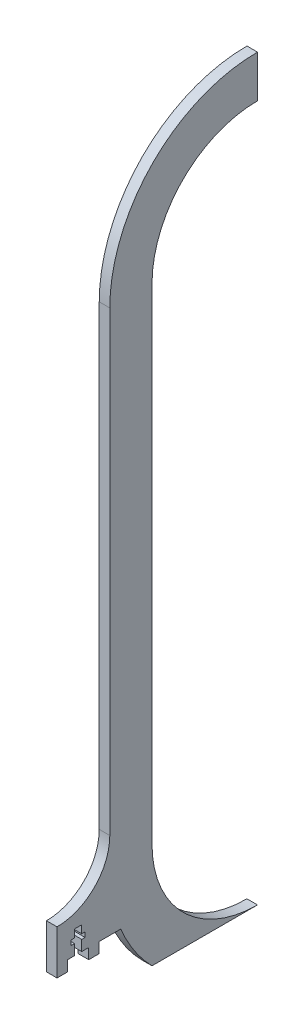
ISO-10303-21;
HEADER;
FILE_DESCRIPTION(('STEP AP214'),'2;1');
FILE_NAME('part.step','',(''),(''),'','','');
FILE_SCHEMA(('AUTOMOTIVE_DESIGN { 1 0 10303 214 1 1 1 1 }'));
ENDSEC;
DATA;
#1=APPLICATION_CONTEXT('core data for automotive mechanical design processes');
#2=APPLICATION_PROTOCOL_DEFINITION('international standard','automotive_design',2000,#1);
#3=PRODUCT_CONTEXT('',#1,'mechanical');
#4=PRODUCT('Part','Part','',(#3));
#5=PRODUCT_RELATED_PRODUCT_CATEGORY('part','',(#4));
#6=PRODUCT_DEFINITION_FORMATION('','',#4);
#7=PRODUCT_DEFINITION_CONTEXT('part definition',#1,'design');
#8=PRODUCT_DEFINITION('design','',#6,#7);
#9=PRODUCT_DEFINITION_SHAPE('','',#8);
#10=(LENGTH_UNIT() NAMED_UNIT(*) SI_UNIT(.MILLI.,.METRE.));
#11=(NAMED_UNIT(*) PLANE_ANGLE_UNIT() SI_UNIT($,.RADIAN.));
#12=(NAMED_UNIT(*) SI_UNIT($,.STERADIAN.) SOLID_ANGLE_UNIT());
#13=UNCERTAINTY_MEASURE_WITH_UNIT(LENGTH_MEASURE(1.E-05),#10,'distance_accuracy_value','');
#14=(GEOMETRIC_REPRESENTATION_CONTEXT(3) GLOBAL_UNCERTAINTY_ASSIGNED_CONTEXT((#13)) GLOBAL_UNIT_ASSIGNED_CONTEXT((#10,
#11,#12)) REPRESENTATION_CONTEXT('',''));
#15=CARTESIAN_POINT('',(0.,0.,0.));
#16=DIRECTION('',(0.,0.,1.));
#17=DIRECTION('',(1.,0.,0.));
#18=AXIS2_PLACEMENT_3D('',#15,#16,#17);
#19=CARTESIAN_POINT('',(6.35,-180.975,42.291));
#20=DIRECTION('',(0.,1.,0.));
#21=DIRECTION('',(0.,0.,1.));
#22=AXIS2_PLACEMENT_3D('',#19,#20,#21);
#23=PLANE('',#22);
#24=DIRECTION('',(0.,0.,-1.));
#25=VECTOR('',#24,1.);
#26=CARTESIAN_POINT('',(0.,-180.975,42.291));
#27=LINE('',#26,#25);
#28=CARTESIAN_POINT('',(0.,-180.975,42.291));
#29=VERTEX_POINT('',#28);
#30=CARTESIAN_POINT('',(0.,-180.975,38.1));
#31=VERTEX_POINT('',#30);
#32=EDGE_CURVE('E253',#29,#31,#27,.T.);
#33=ORIENTED_EDGE('',*,*,#32,.T.);
#34=DIRECTION('',(-1.,0.,0.));
#35=VECTOR('',#34,1.);
#36=CARTESIAN_POINT('',(6.35,-180.975,38.1));
#37=LINE('',#36,#35);
#38=CARTESIAN_POINT('',(6.35,-180.975,38.1));
#39=VERTEX_POINT('',#38);
#40=EDGE_CURVE('E11',#39,#31,#37,.T.);
#41=ORIENTED_EDGE('',*,*,#40,.F.);
#42=DIRECTION('',(0.,0.,-1.));
#43=VECTOR('',#42,1.);
#44=CARTESIAN_POINT('',(6.35,-180.975,42.291));
#45=LINE('',#44,#43);
#46=CARTESIAN_POINT('',(6.35,-180.975,42.291));
#47=VERTEX_POINT('',#46);
#48=EDGE_CURVE('E327',#47,#39,#45,.T.);
#49=ORIENTED_EDGE('',*,*,#48,.F.);
#50=DIRECTION('',(-1.,0.,0.));
#51=VECTOR('',#50,1.);
#52=CARTESIAN_POINT('',(6.35,-180.975,42.291));
#53=LINE('',#52,#51);
#54=EDGE_CURVE('E249',#47,#29,#53,.T.);
#55=ORIENTED_EDGE('',*,*,#54,.T.);
#56=EDGE_LOOP('',(#33,#41,#49,#55));
#57=FACE_BOUND('',#56,.T.);
#58=ADVANCED_FACE('F32',(#57),#23,.F.);
#59=CARTESIAN_POINT('',(6.35,-180.975,38.1));
#60=DIRECTION('',(0.,0.,-1.));
#61=DIRECTION('',(0.,1.,0.));
#62=AXIS2_PLACEMENT_3D('',#59,#60,#61);
#63=PLANE('',#62);
#64=DIRECTION('',(0.,-1.,0.));
#65=VECTOR('',#64,1.);
#66=CARTESIAN_POINT('',(0.,-180.975,38.1));
#67=LINE('',#66,#65);
#68=CARTESIAN_POINT('',(0.,-187.325,38.1000000000001));
#69=VERTEX_POINT('',#68);
#70=EDGE_CURVE('E256',#31,#69,#67,.T.);
#71=ORIENTED_EDGE('',*,*,#70,.T.);
#72=DIRECTION('',(-1.,0.,0.));
#73=VECTOR('',#72,1.);
#74=CARTESIAN_POINT('',(6.35,-187.325,38.1000000000001));
#75=LINE('',#74,#73);
#76=CARTESIAN_POINT('',(6.35,-187.325,38.1000000000001));
#77=VERTEX_POINT('',#76);
#78=EDGE_CURVE('E40',#77,#69,#75,.T.);
#79=ORIENTED_EDGE('',*,*,#78,.F.);
#80=DIRECTION('',(0.,-1.,0.));
#81=VECTOR('',#80,1.);
#82=CARTESIAN_POINT('',(6.35,-180.975,38.1));
#83=LINE('',#82,#81);
#84=EDGE_CURVE('E150',#39,#77,#83,.T.);
#85=ORIENTED_EDGE('',*,*,#84,.F.);
#86=ORIENTED_EDGE('',*,*,#40,.T.);
#87=EDGE_LOOP('',(#71,#79,#85,#86));
#88=FACE_BOUND('',#87,.T.);
#89=ADVANCED_FACE('F476',(#88),#63,.F.);
#90=CARTESIAN_POINT('',(6.35,-187.325,38.1000000000001));
#91=DIRECTION('',(0.,1.,0.));
#92=DIRECTION('',(0.,0.,1.));
#93=AXIS2_PLACEMENT_3D('',#90,#91,#92);
#94=PLANE('',#93);
#95=DIRECTION('',(0.,0.,-1.));
#96=VECTOR('',#95,1.);
#97=CARTESIAN_POINT('',(0.,-187.325,38.1000000000001));
#98=LINE('',#97,#96);
#99=CARTESIAN_POINT('',(0.,-187.325,31.75));
#100=VERTEX_POINT('',#99);
#101=EDGE_CURVE('E258',#69,#100,#98,.T.);
#102=ORIENTED_EDGE('',*,*,#101,.T.);
#103=DIRECTION('',(-1.,0.,0.));
#104=VECTOR('',#103,1.);
#105=CARTESIAN_POINT('',(6.35,-187.325,31.75));
#106=LINE('',#105,#104);
#107=CARTESIAN_POINT('',(6.35,-187.325,31.75));
#108=VERTEX_POINT('',#107);
#109=EDGE_CURVE('E382',#108,#100,#106,.T.);
#110=ORIENTED_EDGE('',*,*,#109,.F.);
#111=DIRECTION('',(0.,0.,-1.));
#112=VECTOR('',#111,1.);
#113=CARTESIAN_POINT('',(6.35,-187.325,38.1000000000001));
#114=LINE('',#113,#112);
#115=EDGE_CURVE('E389',#77,#108,#114,.T.);
#116=ORIENTED_EDGE('',*,*,#115,.F.);
#117=ORIENTED_EDGE('',*,*,#78,.T.);
#118=EDGE_LOOP('',(#102,#110,#116,#117));
#119=FACE_BOUND('',#118,.T.);
#120=ADVANCED_FACE('F387',(#119),#94,.F.);
#121=CARTESIAN_POINT('',(6.35,-180.975,31.75));
#122=DIRECTION('',(0.,0.,-1.));
#123=DIRECTION('',(0.,1.,0.));
#124=AXIS2_PLACEMENT_3D('',#121,#122,#123);
#125=PLANE('',#124);
#126=DIRECTION('',(0.,-1.,0.));
#127=VECTOR('',#126,1.);
#128=CARTESIAN_POINT('',(0.,-180.975,31.75));
#129=LINE('',#128,#127);
#130=CARTESIAN_POINT('',(0.,-180.975,31.75));
#131=VERTEX_POINT('',#130);
#132=EDGE_CURVE('E261',#131,#100,#129,.T.);
#133=ORIENTED_EDGE('',*,*,#132,.F.);
#134=DIRECTION('',(-1.,0.,0.));
#135=VECTOR('',#134,1.);
#136=CARTESIAN_POINT('',(6.35,-180.975,31.75));
#137=LINE('',#136,#135);
#138=CARTESIAN_POINT('',(6.35,-180.975,31.75));
#139=VERTEX_POINT('',#138);
#140=EDGE_CURVE('E380',#139,#131,#137,.T.);
#141=ORIENTED_EDGE('',*,*,#140,.F.);
#142=DIRECTION('',(0.,-1.,0.));
#143=VECTOR('',#142,1.);
#144=CARTESIAN_POINT('',(6.35,-180.975,31.75));
#145=LINE('',#144,#143);
#146=EDGE_CURVE('E401',#139,#108,#145,.T.);
#147=ORIENTED_EDGE('',*,*,#146,.T.);
#148=ORIENTED_EDGE('',*,*,#109,.T.);
#149=EDGE_LOOP('',(#133,#141,#147,#148));
#150=FACE_BOUND('',#149,.T.);
#151=ADVANCED_FACE('F397',(#150),#125,.T.);
#152=CARTESIAN_POINT('',(6.35,-180.975,31.75));
#153=DIRECTION('',(0.,1.,0.));
#154=DIRECTION('',(0.,0.,1.));
#155=AXIS2_PLACEMENT_3D('',#152,#153,#154);
#156=PLANE('',#155);
#157=DIRECTION('',(0.,0.,-1.));
#158=VECTOR('',#157,1.);
#159=CARTESIAN_POINT('',(0.,-180.975,31.75));
#160=LINE('',#159,#158);
#161=CARTESIAN_POINT('',(0.,-180.975,18.7886576662998));
#162=VERTEX_POINT('',#161);
#163=EDGE_CURVE('E264',#131,#162,#160,.T.);
#164=ORIENTED_EDGE('',*,*,#163,.T.);
#165=DIRECTION('',(-1.,0.,0.));
#166=VECTOR('',#165,1.);
#167=CARTESIAN_POINT('',(6.35,-180.975,18.7886576662998));
#168=LINE('',#167,#166);
#169=CARTESIAN_POINT('',(6.35,-180.975,18.7886576662998));
#170=VERTEX_POINT('',#169);
#171=EDGE_CURVE('E377',#170,#162,#168,.T.);
#172=ORIENTED_EDGE('',*,*,#171,.F.);
#173=DIRECTION('',(0.,0.,-1.));
#174=VECTOR('',#173,1.);
#175=CARTESIAN_POINT('',(6.35,-180.975,31.75));
#176=LINE('',#175,#174);
#177=EDGE_CURVE('E402',#139,#170,#176,.T.);
#178=ORIENTED_EDGE('',*,*,#177,.F.);
#179=ORIENTED_EDGE('',*,*,#140,.T.);
#180=EDGE_LOOP('',(#164,#172,#178,#179));
#181=FACE_BOUND('',#180,.T.);
#182=ADVANCED_FACE('F487',(#181),#156,.F.);
#183=CARTESIAN_POINT('',(6.35,-147.332960533307,-63.5000000000001));
#184=DIRECTION('',(-1.,0.,0.));
#185=DIRECTION('',(0.,0.,1.));
#186=AXIS2_PLACEMENT_3D('',#183,#184,#185);
#187=CYLINDRICAL_SURFACE('',#186,88.9);
#188=CARTESIAN_POINT('',(0.,-147.332960533307,-63.5000000000001));
#189=DIRECTION('',(1.,0.,0.));
#190=DIRECTION('',(0.,0.,-1.));
#191=AXIS2_PLACEMENT_3D('',#188,#189,#190);
#192=CIRCLE('',#191,88.9);
#193=CARTESIAN_POINT('',(0.,-209.55,0.));
#194=VERTEX_POINT('',#193);
#195=EDGE_CURVE('E266',#162,#194,#192,.T.);
#196=ORIENTED_EDGE('',*,*,#195,.T.);
#197=DIRECTION('',(-1.,0.,0.));
#198=VECTOR('',#197,1.);
#199=CARTESIAN_POINT('',(6.35,-209.55,0.));
#200=LINE('',#199,#198);
#201=CARTESIAN_POINT('',(6.35,-209.55,0.));
#202=VERTEX_POINT('',#201);
#203=EDGE_CURVE('E375',#202,#194,#200,.T.);
#204=ORIENTED_EDGE('',*,*,#203,.F.);
#205=CARTESIAN_POINT('',(6.35,-147.332960533307,-63.5000000000001));
#206=DIRECTION('',(1.,0.,0.));
#207=DIRECTION('',(0.,0.,-1.));
#208=AXIS2_PLACEMENT_3D('',#205,#206,#207);
#209=CIRCLE('',#208,88.9);
#210=EDGE_CURVE('E404',#170,#202,#209,.T.);
#211=ORIENTED_EDGE('',*,*,#210,.F.);
#212=ORIENTED_EDGE('',*,*,#171,.T.);
#213=EDGE_LOOP('',(#196,#204,#211,#212));
#214=FACE_BOUND('',#213,.T.);
#215=ADVANCED_FACE('F490',(#214),#187,.T.);
#216=CARTESIAN_POINT('',(6.35,-209.55,-63.5000000000001));
#217=DIRECTION('',(0.,-1.,0.));
#218=DIRECTION('',(0.,0.,-1.));
#219=AXIS2_PLACEMENT_3D('',#216,#217,#218);
#220=PLANE('',#219);
#221=DIRECTION('',(0.,0.,1.));
#222=VECTOR('',#221,1.);
#223=CARTESIAN_POINT('',(0.,-209.55,-63.5000000000001));
#224=LINE('',#223,#222);
#225=CARTESIAN_POINT('',(0.,-209.55,-63.5000000000001));
#226=VERTEX_POINT('',#225);
#227=EDGE_CURVE('E269',#226,#194,#224,.T.);
#228=ORIENTED_EDGE('',*,*,#227,.F.);
#229=DIRECTION('',(-1.,0.,0.));
#230=VECTOR('',#229,1.);
#231=CARTESIAN_POINT('',(6.35,-209.55,-63.5000000000001));
#232=LINE('',#231,#230);
#233=CARTESIAN_POINT('',(6.35,-209.55,-63.5000000000001));
#234=VERTEX_POINT('',#233);
#235=EDGE_CURVE('E373',#234,#226,#232,.T.);
#236=ORIENTED_EDGE('',*,*,#235,.F.);
#237=DIRECTION('',(0.,0.,1.));
#238=VECTOR('',#237,1.);
#239=CARTESIAN_POINT('',(6.35,-209.55,-63.5000000000001));
#240=LINE('',#239,#238);
#241=EDGE_CURVE('E410',#234,#202,#240,.T.);
#242=ORIENTED_EDGE('',*,*,#241,.T.);
#243=ORIENTED_EDGE('',*,*,#203,.T.);
#244=EDGE_LOOP('',(#228,#236,#242,#243));
#245=FACE_BOUND('',#244,.T.);
#246=ADVANCED_FACE('F494',(#245),#220,.T.);
#247=CARTESIAN_POINT('',(6.35,-146.05,-63.5));
#248=DIRECTION('',(-1.,0.,0.));
#249=DIRECTION('',(0.,0.,1.));
#250=AXIS2_PLACEMENT_3D('',#247,#248,#249);
#251=CYLINDRICAL_SURFACE('',#250,63.5);
#252=CARTESIAN_POINT('',(0.,-146.05,-63.5));
#253=DIRECTION('',(1.,0.,0.));
#254=DIRECTION('',(0.,0.,-1.));
#255=AXIS2_PLACEMENT_3D('',#252,#253,#254);
#256=CIRCLE('',#255,63.5);
#257=CARTESIAN_POINT('',(0.,-146.05,0.));
#258=VERTEX_POINT('',#257);
#259=EDGE_CURVE('E272',#258,#226,#256,.T.);
#260=ORIENTED_EDGE('',*,*,#259,.F.);
#261=DIRECTION('',(-1.,0.,0.));
#262=VECTOR('',#261,1.);
#263=CARTESIAN_POINT('',(6.35,-146.05,0.));
#264=LINE('',#263,#262);
#265=CARTESIAN_POINT('',(6.35,-146.05,0.));
#266=VERTEX_POINT('',#265);
#267=EDGE_CURVE('E371',#266,#258,#264,.T.);
#268=ORIENTED_EDGE('',*,*,#267,.F.);
#269=CARTESIAN_POINT('',(6.35,-146.05,-63.5));
#270=DIRECTION('',(1.,0.,0.));
#271=DIRECTION('',(0.,0.,-1.));
#272=AXIS2_PLACEMENT_3D('',#269,#270,#271);
#273=CIRCLE('',#272,63.5);
#274=EDGE_CURVE('E413',#266,#234,#273,.T.);
#275=ORIENTED_EDGE('',*,*,#274,.T.);
#276=ORIENTED_EDGE('',*,*,#235,.T.);
#277=EDGE_LOOP('',(#260,#268,#275,#276));
#278=FACE_BOUND('',#277,.T.);
#279=ADVANCED_FACE('F498',(#278),#251,.F.);
#280=CARTESIAN_POINT('',(6.35,146.05,0.));
#281=DIRECTION('',(0.,0.,-1.));
#282=DIRECTION('',(-1.,0.,0.));
#283=AXIS2_PLACEMENT_3D('',#280,#281,#282);
#284=PLANE('',#283);
#285=DIRECTION('',(0.,-1.,0.));
#286=VECTOR('',#285,1.);
#287=CARTESIAN_POINT('',(0.,146.05,0.));
#288=LINE('',#287,#286);
#289=CARTESIAN_POINT('',(0.,146.05,0.));
#290=VERTEX_POINT('',#289);
#291=EDGE_CURVE('E275',#290,#258,#288,.T.);
#292=ORIENTED_EDGE('',*,*,#291,.F.);
#293=DIRECTION('',(-1.,0.,0.));
#294=VECTOR('',#293,1.);
#295=CARTESIAN_POINT('',(6.35,146.05,0.));
#296=LINE('',#295,#294);
#297=CARTESIAN_POINT('',(6.35,146.05,0.));
#298=VERTEX_POINT('',#297);
#299=EDGE_CURVE('E369',#298,#290,#296,.T.);
#300=ORIENTED_EDGE('',*,*,#299,.F.);
#301=DIRECTION('',(0.,-1.,0.));
#302=VECTOR('',#301,1.);
#303=CARTESIAN_POINT('',(6.35,146.05,0.));
#304=LINE('',#303,#302);
#305=EDGE_CURVE('E416',#298,#266,#304,.T.);
#306=ORIENTED_EDGE('',*,*,#305,.T.);
#307=ORIENTED_EDGE('',*,*,#267,.T.);
#308=EDGE_LOOP('',(#292,#300,#306,#307));
#309=FACE_BOUND('',#308,.T.);
#310=ADVANCED_FACE('F502',(#309),#284,.T.);
#311=CARTESIAN_POINT('',(6.35,146.05,-63.5));
#312=DIRECTION('',(-1.,0.,0.));
#313=DIRECTION('',(0.,0.,1.));
#314=AXIS2_PLACEMENT_3D('',#311,#312,#313);
#315=CYLINDRICAL_SURFACE('',#314,63.5);
#316=CARTESIAN_POINT('',(0.,146.05,-63.5));
#317=DIRECTION('',(-1.,0.,0.));
#318=DIRECTION('',(0.,0.,1.));
#319=AXIS2_PLACEMENT_3D('',#316,#317,#318);
#320=CIRCLE('',#319,63.5);
#321=CARTESIAN_POINT('',(0.,209.55,-63.5));
#322=VERTEX_POINT('',#321);
#323=EDGE_CURVE('E278',#290,#322,#320,.T.);
#324=ORIENTED_EDGE('',*,*,#323,.T.);
#325=DIRECTION('',(-1.,0.,0.));
#326=VECTOR('',#325,1.);
#327=CARTESIAN_POINT('',(6.35,209.55,-63.5));
#328=LINE('',#327,#326);
#329=CARTESIAN_POINT('',(6.35,209.55,-63.5));
#330=VERTEX_POINT('',#329);
#331=EDGE_CURVE('E366',#330,#322,#328,.T.);
#332=ORIENTED_EDGE('',*,*,#331,.F.);
#333=CARTESIAN_POINT('',(6.35,146.05,-63.5));
#334=DIRECTION('',(-1.,0.,0.));
#335=DIRECTION('',(0.,0.,1.));
#336=AXIS2_PLACEMENT_3D('',#333,#334,#335);
#337=CIRCLE('',#336,63.5);
#338=EDGE_CURVE('E419',#298,#330,#337,.T.);
#339=ORIENTED_EDGE('',*,*,#338,.F.);
#340=ORIENTED_EDGE('',*,*,#299,.T.);
#341=EDGE_LOOP('',(#324,#332,#339,#340));
#342=FACE_BOUND('',#341,.T.);
#343=ADVANCED_FACE('F506',(#342),#315,.F.);
#344=CARTESIAN_POINT('',(6.35,209.55,-63.5));
#345=DIRECTION('',(0.,0.,1.));
#346=DIRECTION('',(1.,0.,0.));
#347=AXIS2_PLACEMENT_3D('',#344,#345,#346);
#348=PLANE('',#347);
#349=DIRECTION('',(0.,1.,0.));
#350=VECTOR('',#349,1.);
#351=CARTESIAN_POINT('',(0.,209.55,-63.5));
#352=LINE('',#351,#350);
#353=CARTESIAN_POINT('',(0.,234.95,-63.5));
#354=VERTEX_POINT('',#353);
#355=EDGE_CURVE('E280',#322,#354,#352,.T.);
#356=ORIENTED_EDGE('',*,*,#355,.T.);
#357=DIRECTION('',(-1.,0.,0.));
#358=VECTOR('',#357,1.);
#359=CARTESIAN_POINT('',(6.35,234.95,-63.5));
#360=LINE('',#359,#358);
#361=CARTESIAN_POINT('',(6.35,234.95,-63.5));
#362=VERTEX_POINT('',#361);
#363=EDGE_CURVE('E363',#362,#354,#360,.T.);
#364=ORIENTED_EDGE('',*,*,#363,.F.);
#365=DIRECTION('',(0.,1.,0.));
#366=VECTOR('',#365,1.);
#367=CARTESIAN_POINT('',(6.35,209.55,-63.5));
#368=LINE('',#367,#366);
#369=EDGE_CURVE('E421',#330,#362,#368,.T.);
#370=ORIENTED_EDGE('',*,*,#369,.F.);
#371=ORIENTED_EDGE('',*,*,#331,.T.);
#372=EDGE_LOOP('',(#356,#364,#370,#371));
#373=FACE_BOUND('',#372,.T.);
#374=ADVANCED_FACE('F510',(#373),#348,.F.);
#375=CARTESIAN_POINT('',(6.35,146.05,-63.5));
#376=DIRECTION('',(-1.,0.,0.));
#377=DIRECTION('',(0.,0.,1.));
#378=AXIS2_PLACEMENT_3D('',#375,#376,#377);
#379=CYLINDRICAL_SURFACE('',#378,88.9);
#380=CARTESIAN_POINT('',(0.,146.05,-63.5));
#381=DIRECTION('',(1.,0.,0.));
#382=DIRECTION('',(0.,0.,-1.));
#383=AXIS2_PLACEMENT_3D('',#380,#381,#382);
#384=CIRCLE('',#383,88.9);
#385=CARTESIAN_POINT('',(0.,146.05,25.4));
#386=VERTEX_POINT('',#385);
#387=EDGE_CURVE('E282',#354,#386,#384,.T.);
#388=ORIENTED_EDGE('',*,*,#387,.T.);
#389=DIRECTION('',(-1.,0.,0.));
#390=VECTOR('',#389,1.);
#391=CARTESIAN_POINT('',(6.35,146.05,25.4));
#392=LINE('',#391,#390);
#393=CARTESIAN_POINT('',(6.35,146.05,25.4));
#394=VERTEX_POINT('',#393);
#395=EDGE_CURVE('E360',#394,#386,#392,.T.);
#396=ORIENTED_EDGE('',*,*,#395,.F.);
#397=CARTESIAN_POINT('',(6.35,146.05,-63.5));
#398=DIRECTION('',(1.,0.,0.));
#399=DIRECTION('',(0.,0.,-1.));
#400=AXIS2_PLACEMENT_3D('',#397,#398,#399);
#401=CIRCLE('',#400,88.9);
#402=EDGE_CURVE('E423',#362,#394,#401,.T.);
#403=ORIENTED_EDGE('',*,*,#402,.F.);
#404=ORIENTED_EDGE('',*,*,#363,.T.);
#405=EDGE_LOOP('',(#388,#396,#403,#404));
#406=FACE_BOUND('',#405,.T.);
#407=ADVANCED_FACE('F514',(#406),#379,.T.);
#408=CARTESIAN_POINT('',(6.35,146.05,25.4));
#409=DIRECTION('',(0.,0.,-1.));
#410=DIRECTION('',(0.,1.,0.));
#411=AXIS2_PLACEMENT_3D('',#408,#409,#410);
#412=PLANE('',#411);
#413=DIRECTION('',(0.,-1.,0.));
#414=VECTOR('',#413,1.);
#415=CARTESIAN_POINT('',(0.,146.05,25.4));
#416=LINE('',#415,#414);
#417=CARTESIAN_POINT('',(0.,-128.904999999999,25.4));
#418=VERTEX_POINT('',#417);
#419=EDGE_CURVE('E284',#386,#418,#416,.T.);
#420=ORIENTED_EDGE('',*,*,#419,.T.);
#421=DIRECTION('',(-1.,0.,0.));
#422=VECTOR('',#421,1.);
#423=CARTESIAN_POINT('',(6.35,-128.904999999999,25.4));
#424=LINE('',#423,#422);
#425=CARTESIAN_POINT('',(6.35,-128.904999999999,25.4));
#426=VERTEX_POINT('',#425);
#427=EDGE_CURVE('E358',#426,#418,#424,.T.);
#428=ORIENTED_EDGE('',*,*,#427,.F.);
#429=DIRECTION('',(0.,-1.,0.));
#430=VECTOR('',#429,1.);
#431=CARTESIAN_POINT('',(6.35,146.05,25.4));
#432=LINE('',#431,#430);
#433=EDGE_CURVE('E425',#394,#426,#432,.T.);
#434=ORIENTED_EDGE('',*,*,#433,.F.);
#435=ORIENTED_EDGE('',*,*,#395,.T.);
#436=EDGE_LOOP('',(#420,#428,#434,#435));
#437=FACE_BOUND('',#436,.T.);
#438=ADVANCED_FACE('F518',(#437),#412,.F.);
#439=CARTESIAN_POINT('',(6.35,-128.904999999999,57.15));
#440=DIRECTION('',(-1.,0.,0.));
#441=DIRECTION('',(0.,0.,1.));
#442=AXIS2_PLACEMENT_3D('',#439,#440,#441);
#443=CYLINDRICAL_SURFACE('',#442,31.75);
#444=CARTESIAN_POINT('',(0.,-128.904999999999,57.15));
#445=DIRECTION('',(1.,0.,0.));
#446=DIRECTION('',(0.,0.,-1.));
#447=AXIS2_PLACEMENT_3D('',#444,#445,#446);
#448=CIRCLE('',#447,31.75);
#449=CARTESIAN_POINT('',(0.,-160.654999999999,57.15));
#450=VERTEX_POINT('',#449);
#451=EDGE_CURVE('E287',#450,#418,#448,.T.);
#452=ORIENTED_EDGE('',*,*,#451,.F.);
#453=DIRECTION('',(-1.,0.,0.));
#454=VECTOR('',#453,1.);
#455=CARTESIAN_POINT('',(6.35,-160.654999999999,57.15));
#456=LINE('',#455,#454);
#457=CARTESIAN_POINT('',(6.35,-160.654999999999,57.15));
#458=VERTEX_POINT('',#457);
#459=EDGE_CURVE('E356',#458,#450,#456,.T.);
#460=ORIENTED_EDGE('',*,*,#459,.F.);
#461=CARTESIAN_POINT('',(6.35,-128.904999999999,57.15));
#462=DIRECTION('',(1.,0.,0.));
#463=DIRECTION('',(0.,0.,-1.));
#464=AXIS2_PLACEMENT_3D('',#461,#462,#463);
#465=CIRCLE('',#464,31.75);
#466=EDGE_CURVE('E427',#458,#426,#465,.T.);
#467=ORIENTED_EDGE('',*,*,#466,.T.);
#468=ORIENTED_EDGE('',*,*,#427,.T.);
#469=EDGE_LOOP('',(#452,#460,#467,#468));
#470=FACE_BOUND('',#469,.T.);
#471=ADVANCED_FACE('F522',(#470),#443,.F.);
#472=CARTESIAN_POINT('',(6.35,-160.654999999999,57.15));
#473=DIRECTION('',(0.,0.,-1.));
#474=DIRECTION('',(0.,1.,0.));
#475=AXIS2_PLACEMENT_3D('',#472,#473,#474);
#476=PLANE('',#475);
#477=DIRECTION('',(0.,-1.,0.));
#478=VECTOR('',#477,1.);
#479=CARTESIAN_POINT('',(0.,-160.654999999999,57.15));
#480=LINE('',#479,#478);
#481=CARTESIAN_POINT('',(0.,-187.325,57.15));
#482=VERTEX_POINT('',#481);
#483=EDGE_CURVE('E290',#450,#482,#480,.T.);
#484=ORIENTED_EDGE('',*,*,#483,.T.);
#485=DIRECTION('',(-1.,0.,0.));
#486=VECTOR('',#485,1.);
#487=CARTESIAN_POINT('',(6.35,-187.325,57.15));
#488=LINE('',#487,#486);
#489=CARTESIAN_POINT('',(6.35,-187.325,57.15));
#490=VERTEX_POINT('',#489);
#491=EDGE_CURVE('E353',#490,#482,#488,.T.);
#492=ORIENTED_EDGE('',*,*,#491,.F.);
#493=DIRECTION('',(0.,-1.,0.));
#494=VECTOR('',#493,1.);
#495=CARTESIAN_POINT('',(6.35,-160.654999999999,57.15));
#496=LINE('',#495,#494);
#497=EDGE_CURVE('E430',#458,#490,#496,.T.);
#498=ORIENTED_EDGE('',*,*,#497,.F.);
#499=ORIENTED_EDGE('',*,*,#459,.T.);
#500=EDGE_LOOP('',(#484,#492,#498,#499));
#501=FACE_BOUND('',#500,.T.);
#502=ADVANCED_FACE('F526',(#501),#476,.F.);
#503=CARTESIAN_POINT('',(6.35,-187.325,57.15));
#504=DIRECTION('',(0.,1.,0.));
#505=DIRECTION('',(0.,0.,1.));
#506=AXIS2_PLACEMENT_3D('',#503,#504,#505);
#507=PLANE('',#506);
#508=DIRECTION('',(0.,0.,-1.));
#509=VECTOR('',#508,1.);
#510=CARTESIAN_POINT('',(0.,-187.325,57.15));
#511=LINE('',#510,#509);
#512=CARTESIAN_POINT('',(0.,-187.325,50.8));
#513=VERTEX_POINT('',#512);
#514=EDGE_CURVE('E292',#482,#513,#511,.T.);
#515=ORIENTED_EDGE('',*,*,#514,.T.);
#516=DIRECTION('',(-1.,0.,0.));
#517=VECTOR('',#516,1.);
#518=CARTESIAN_POINT('',(6.35,-187.325,50.8));
#519=LINE('',#518,#517);
#520=CARTESIAN_POINT('',(6.35,-187.325,50.8));
#521=VERTEX_POINT('',#520);
#522=EDGE_CURVE('E350',#521,#513,#519,.T.);
#523=ORIENTED_EDGE('',*,*,#522,.F.);
#524=DIRECTION('',(0.,0.,-1.));
#525=VECTOR('',#524,1.);
#526=CARTESIAN_POINT('',(6.35,-187.325,57.15));
#527=LINE('',#526,#525);
#528=EDGE_CURVE('E432',#490,#521,#527,.T.);
#529=ORIENTED_EDGE('',*,*,#528,.F.);
#530=ORIENTED_EDGE('',*,*,#491,.T.);
#531=EDGE_LOOP('',(#515,#523,#529,#530));
#532=FACE_BOUND('',#531,.T.);
#533=ADVANCED_FACE('F530',(#532),#507,.F.);
#534=CARTESIAN_POINT('',(6.35,-187.325,50.8));
#535=DIRECTION('',(0.,0.,1.));
#536=DIRECTION('',(0.,-1.,0.));
#537=AXIS2_PLACEMENT_3D('',#534,#535,#536);
#538=PLANE('',#537);
#539=DIRECTION('',(0.,1.,0.));
#540=VECTOR('',#539,1.);
#541=CARTESIAN_POINT('',(0.,-187.325,50.8));
#542=LINE('',#541,#540);
#543=CARTESIAN_POINT('',(0.,-180.975,50.8));
#544=VERTEX_POINT('',#543);
#545=EDGE_CURVE('E294',#513,#544,#542,.T.);
#546=ORIENTED_EDGE('',*,*,#545,.T.);
#547=DIRECTION('',(-1.,0.,0.));
#548=VECTOR('',#547,1.);
#549=CARTESIAN_POINT('',(6.35,-180.975,50.8));
#550=LINE('',#549,#548);
#551=CARTESIAN_POINT('',(6.35,-180.975,50.8));
#552=VERTEX_POINT('',#551);
#553=EDGE_CURVE('E347',#552,#544,#550,.T.);
#554=ORIENTED_EDGE('',*,*,#553,.F.);
#555=DIRECTION('',(0.,1.,0.));
#556=VECTOR('',#555,1.);
#557=CARTESIAN_POINT('',(6.35,-187.325,50.8));
#558=LINE('',#557,#556);
#559=EDGE_CURVE('E434',#521,#552,#558,.T.);
#560=ORIENTED_EDGE('',*,*,#559,.F.);
#561=ORIENTED_EDGE('',*,*,#522,.T.);
#562=EDGE_LOOP('',(#546,#554,#560,#561));
#563=FACE_BOUND('',#562,.T.);
#564=ADVANCED_FACE('F534',(#563),#538,.F.);
#565=CARTESIAN_POINT('',(6.35,-180.975,50.8));
#566=DIRECTION('',(0.,1.,0.));
#567=DIRECTION('',(0.,0.,1.));
#568=AXIS2_PLACEMENT_3D('',#565,#566,#567);
#569=PLANE('',#568);
#570=DIRECTION('',(0.,0.,-1.));
#571=VECTOR('',#570,1.);
#572=CARTESIAN_POINT('',(0.,-180.975,50.8));
#573=LINE('',#572,#571);
#574=CARTESIAN_POINT('',(0.,-180.975,46.609));
#575=VERTEX_POINT('',#574);
#576=EDGE_CURVE('E296',#544,#575,#573,.T.);
#577=ORIENTED_EDGE('',*,*,#576,.T.);
#578=DIRECTION('',(-1.,0.,0.));
#579=VECTOR('',#578,1.);
#580=CARTESIAN_POINT('',(6.35,-180.975,46.609));
#581=LINE('',#580,#579);
#582=CARTESIAN_POINT('',(6.35,-180.975,46.609));
#583=VERTEX_POINT('',#582);
#584=EDGE_CURVE('E345',#583,#575,#581,.T.);
#585=ORIENTED_EDGE('',*,*,#584,.F.);
#586=DIRECTION('',(0.,0.,-1.));
#587=VECTOR('',#586,1.);
#588=CARTESIAN_POINT('',(6.35,-180.975,50.8));
#589=LINE('',#588,#587);
#590=EDGE_CURVE('E436',#552,#583,#589,.T.);
#591=ORIENTED_EDGE('',*,*,#590,.F.);
#592=ORIENTED_EDGE('',*,*,#553,.T.);
#593=EDGE_LOOP('',(#577,#585,#591,#592));
#594=FACE_BOUND('',#593,.T.);
#595=ADVANCED_FACE('F538',(#594),#569,.F.);
#596=CARTESIAN_POINT('',(6.35,-174.625,46.609));
#597=DIRECTION('',(0.,0.,-1.));
#598=DIRECTION('',(0.,1.,0.));
#599=AXIS2_PLACEMENT_3D('',#596,#597,#598);
#600=PLANE('',#599);
#601=DIRECTION('',(0.,-1.,0.));
#602=VECTOR('',#601,1.);
#603=CARTESIAN_POINT('',(0.,-174.625,46.609));
#604=LINE('',#603,#602);
#605=CARTESIAN_POINT('',(0.,-174.625,46.609));
#606=VERTEX_POINT('',#605);
#607=EDGE_CURVE('E299',#606,#575,#604,.T.);
#608=ORIENTED_EDGE('',*,*,#607,.F.);
#609=DIRECTION('',(-1.,0.,0.));
#610=VECTOR('',#609,1.);
#611=CARTESIAN_POINT('',(6.35,-174.625,46.609));
#612=LINE('',#611,#610);
#613=CARTESIAN_POINT('',(6.35,-174.625,46.609));
#614=VERTEX_POINT('',#613);
#615=EDGE_CURVE('E343',#614,#606,#612,.T.);
#616=ORIENTED_EDGE('',*,*,#615,.F.);
#617=DIRECTION('',(0.,-1.,0.));
#618=VECTOR('',#617,1.);
#619=CARTESIAN_POINT('',(6.35,-174.625,46.609));
#620=LINE('',#619,#618);
#621=EDGE_CURVE('E438',#614,#583,#620,.T.);
#622=ORIENTED_EDGE('',*,*,#621,.T.);
#623=ORIENTED_EDGE('',*,*,#584,.T.);
#624=EDGE_LOOP('',(#608,#616,#622,#623));
#625=FACE_BOUND('',#624,.T.);
#626=ADVANCED_FACE('F542',(#625),#600,.T.);
#627=CARTESIAN_POINT('',(6.35,-174.625,48.649999982));
#628=DIRECTION('',(0.,1.,0.));
#629=DIRECTION('',(0.,0.,1.));
#630=AXIS2_PLACEMENT_3D('',#627,#628,#629);
#631=PLANE('',#630);
#632=DIRECTION('',(0.,0.,-1.));
#633=VECTOR('',#632,1.);
#634=CARTESIAN_POINT('',(0.,-174.625,48.649999982));
#635=LINE('',#634,#633);
#636=CARTESIAN_POINT('',(0.,-174.625,48.649999982));
#637=VERTEX_POINT('',#636);
#638=EDGE_CURVE('E302',#637,#606,#635,.T.);
#639=ORIENTED_EDGE('',*,*,#638,.F.);
#640=DIRECTION('',(-1.,0.,0.));
#641=VECTOR('',#640,1.);
#642=CARTESIAN_POINT('',(6.35,-174.625,48.649999982));
#643=LINE('',#642,#641);
#644=CARTESIAN_POINT('',(6.35,-174.625,48.649999982));
#645=VERTEX_POINT('',#644);
#646=EDGE_CURVE('E341',#645,#637,#643,.T.);
#647=ORIENTED_EDGE('',*,*,#646,.F.);
#648=DIRECTION('',(0.,0.,-1.));
#649=VECTOR('',#648,1.);
#650=CARTESIAN_POINT('',(6.35,-174.625,48.649999982));
#651=LINE('',#650,#649);
#652=EDGE_CURVE('E441',#645,#614,#651,.T.);
#653=ORIENTED_EDGE('',*,*,#652,.T.);
#654=ORIENTED_EDGE('',*,*,#615,.T.);
#655=EDGE_LOOP('',(#639,#647,#653,#654));
#656=FACE_BOUND('',#655,.T.);
#657=ADVANCED_FACE('F546',(#656),#631,.T.);
#658=CARTESIAN_POINT('',(6.35,-171.724999958003,48.649999982));
#659=DIRECTION('',(0.,0.,-1.));
#660=DIRECTION('',(-1.,0.,0.));
#661=AXIS2_PLACEMENT_3D('',#658,#659,#660);
#662=PLANE('',#661);
#663=DIRECTION('',(0.,-1.,0.));
#664=VECTOR('',#663,1.);
#665=CARTESIAN_POINT('',(0.,-171.724999958003,48.649999982));
#666=LINE('',#665,#664);
#667=CARTESIAN_POINT('',(0.,-171.724999958003,48.649999982));
#668=VERTEX_POINT('',#667);
#669=EDGE_CURVE('E305',#668,#637,#666,.T.);
#670=ORIENTED_EDGE('',*,*,#669,.F.);
#671=DIRECTION('',(-1.,0.,0.));
#672=VECTOR('',#671,1.);
#673=CARTESIAN_POINT('',(6.35,-171.724999958003,48.649999982));
#674=LINE('',#673,#672);
#675=CARTESIAN_POINT('',(6.35,-171.724999958003,48.649999982));
#676=VERTEX_POINT('',#675);
#677=EDGE_CURVE('E339',#676,#668,#674,.T.);
#678=ORIENTED_EDGE('',*,*,#677,.F.);
#679=DIRECTION('',(0.,-1.,0.));
#680=VECTOR('',#679,1.);
#681=CARTESIAN_POINT('',(6.35,-171.724999958003,48.649999982));
#682=LINE('',#681,#680);
#683=EDGE_CURVE('E444',#676,#645,#682,.T.);
#684=ORIENTED_EDGE('',*,*,#683,.T.);
#685=ORIENTED_EDGE('',*,*,#646,.T.);
#686=EDGE_LOOP('',(#670,#678,#684,#685));
#687=FACE_BOUND('',#686,.T.);
#688=ADVANCED_FACE('F550',(#687),#662,.T.);
#689=CARTESIAN_POINT('',(6.35,-171.724999958003,46.609));
#690=DIRECTION('',(0.,-1.,0.));
#691=DIRECTION('',(0.,0.,-1.));
#692=AXIS2_PLACEMENT_3D('',#689,#690,#691);
#693=PLANE('',#692);
#694=DIRECTION('',(0.,0.,1.));
#695=VECTOR('',#694,1.);
#696=CARTESIAN_POINT('',(0.,-171.724999958003,46.609));
#697=LINE('',#696,#695);
#698=CARTESIAN_POINT('',(0.,-171.724999958003,46.609));
#699=VERTEX_POINT('',#698);
#700=EDGE_CURVE('E308',#699,#668,#697,.T.);
#701=ORIENTED_EDGE('',*,*,#700,.F.);
#702=DIRECTION('',(-1.,0.,0.));
#703=VECTOR('',#702,1.);
#704=CARTESIAN_POINT('',(6.35,-171.724999958003,46.609));
#705=LINE('',#704,#703);
#706=CARTESIAN_POINT('',(6.35,-171.724999958003,46.609));
#707=VERTEX_POINT('',#706);
#708=EDGE_CURVE('E337',#707,#699,#705,.T.);
#709=ORIENTED_EDGE('',*,*,#708,.F.);
#710=DIRECTION('',(0.,0.,1.));
#711=VECTOR('',#710,1.);
#712=CARTESIAN_POINT('',(6.35,-171.724999958003,46.609));
#713=LINE('',#712,#711);
#714=EDGE_CURVE('E447',#707,#676,#713,.T.);
#715=ORIENTED_EDGE('',*,*,#714,.T.);
#716=ORIENTED_EDGE('',*,*,#677,.T.);
#717=EDGE_LOOP('',(#701,#709,#715,#716));
#718=FACE_BOUND('',#717,.T.);
#719=ADVANCED_FACE('F554',(#718),#693,.T.);
#720=CARTESIAN_POINT('',(6.35,-167.005,46.609));
#721=DIRECTION('',(0.,0.,-1.));
#722=DIRECTION('',(-1.,0.,0.));
#723=AXIS2_PLACEMENT_3D('',#720,#721,#722);
#724=PLANE('',#723);
#725=DIRECTION('',(0.,-1.,0.));
#726=VECTOR('',#725,1.);
#727=CARTESIAN_POINT('',(0.,-167.005,46.609));
#728=LINE('',#727,#726);
#729=CARTESIAN_POINT('',(0.,-167.005,46.609));
#730=VERTEX_POINT('',#729);
#731=EDGE_CURVE('E311',#730,#699,#728,.T.);
#732=ORIENTED_EDGE('',*,*,#731,.F.);
#733=DIRECTION('',(-1.,0.,0.));
#734=VECTOR('',#733,1.);
#735=CARTESIAN_POINT('',(6.35,-167.005,46.609));
#736=LINE('',#735,#734);
#737=CARTESIAN_POINT('',(6.35,-167.005,46.609));
#738=VERTEX_POINT('',#737);
#739=EDGE_CURVE('E335',#738,#730,#736,.T.);
#740=ORIENTED_EDGE('',*,*,#739,.F.);
#741=DIRECTION('',(0.,-1.,0.));
#742=VECTOR('',#741,1.);
#743=CARTESIAN_POINT('',(6.35,-167.005,46.609));
#744=LINE('',#743,#742);
#745=EDGE_CURVE('E450',#738,#707,#744,.T.);
#746=ORIENTED_EDGE('',*,*,#745,.T.);
#747=ORIENTED_EDGE('',*,*,#708,.T.);
#748=EDGE_LOOP('',(#732,#740,#746,#747));
#749=FACE_BOUND('',#748,.T.);
#750=ADVANCED_FACE('F558',(#749),#724,.T.);
#751=CARTESIAN_POINT('',(6.35,-167.005,42.291));
#752=DIRECTION('',(0.,-1.,0.));
#753=DIRECTION('',(0.,0.,-1.));
#754=AXIS2_PLACEMENT_3D('',#751,#752,#753);
#755=PLANE('',#754);
#756=DIRECTION('',(0.,0.,1.));
#757=VECTOR('',#756,1.);
#758=CARTESIAN_POINT('',(0.,-167.005,42.291));
#759=LINE('',#758,#757);
#760=CARTESIAN_POINT('',(0.,-167.005,42.291));
#761=VERTEX_POINT('',#760);
#762=EDGE_CURVE('E314',#761,#730,#759,.T.);
#763=ORIENTED_EDGE('',*,*,#762,.F.);
#764=DIRECTION('',(-1.,0.,0.));
#765=VECTOR('',#764,1.);
#766=CARTESIAN_POINT('',(6.35,-167.005,42.291));
#767=LINE('',#766,#765);
#768=CARTESIAN_POINT('',(6.35,-167.005,42.291));
#769=VERTEX_POINT('',#768);
#770=EDGE_CURVE('E333',#769,#761,#767,.T.);
#771=ORIENTED_EDGE('',*,*,#770,.F.);
#772=DIRECTION('',(0.,0.,1.));
#773=VECTOR('',#772,1.);
#774=CARTESIAN_POINT('',(6.35,-167.005,42.291));
#775=LINE('',#774,#773);
#776=EDGE_CURVE('E453',#769,#738,#775,.T.);
#777=ORIENTED_EDGE('',*,*,#776,.T.);
#778=ORIENTED_EDGE('',*,*,#739,.T.);
#779=EDGE_LOOP('',(#763,#771,#777,#778));
#780=FACE_BOUND('',#779,.T.);
#781=ADVANCED_FACE('F562',(#780),#755,.T.);
#782=CARTESIAN_POINT('',(6.35,-171.724999958003,42.291));
#783=DIRECTION('',(0.,0.,1.));
#784=DIRECTION('',(1.,0.,0.));
#785=AXIS2_PLACEMENT_3D('',#782,#783,#784);
#786=PLANE('',#785);
#787=DIRECTION('',(0.,1.,0.));
#788=VECTOR('',#787,1.);
#789=CARTESIAN_POINT('',(0.,-171.724999958003,42.291));
#790=LINE('',#789,#788);
#791=CARTESIAN_POINT('',(0.,-171.724999958003,42.291));
#792=VERTEX_POINT('',#791);
#793=EDGE_CURVE('E317',#792,#761,#790,.T.);
#794=ORIENTED_EDGE('',*,*,#793,.F.);
#795=DIRECTION('',(-1.,0.,0.));
#796=VECTOR('',#795,1.);
#797=CARTESIAN_POINT('',(6.35,-171.724999958003,42.291));
#798=LINE('',#797,#796);
#799=CARTESIAN_POINT('',(6.35,-171.724999958003,42.291));
#800=VERTEX_POINT('',#799);
#801=EDGE_CURVE('E331',#800,#792,#798,.T.);
#802=ORIENTED_EDGE('',*,*,#801,.F.);
#803=DIRECTION('',(0.,1.,0.));
#804=VECTOR('',#803,1.);
#805=CARTESIAN_POINT('',(6.35,-171.724999958003,42.291));
#806=LINE('',#805,#804);
#807=EDGE_CURVE('E456',#800,#769,#806,.T.);
#808=ORIENTED_EDGE('',*,*,#807,.T.);
#809=ORIENTED_EDGE('',*,*,#770,.T.);
#810=EDGE_LOOP('',(#794,#802,#808,#809));
#811=FACE_BOUND('',#810,.T.);
#812=ADVANCED_FACE('F566',(#811),#786,.T.);
#813=CARTESIAN_POINT('',(6.35,-171.724999958003,40.250000018));
#814=DIRECTION('',(0.,-1.,0.));
#815=DIRECTION('',(0.,0.,-1.));
#816=AXIS2_PLACEMENT_3D('',#813,#814,#815);
#817=PLANE('',#816);
#818=DIRECTION('',(0.,0.,1.));
#819=VECTOR('',#818,1.);
#820=CARTESIAN_POINT('',(0.,-171.724999958003,40.250000018));
#821=LINE('',#820,#819);
#822=CARTESIAN_POINT('',(0.,-171.724999958003,40.250000018));
#823=VERTEX_POINT('',#822);
#824=EDGE_CURVE('E320',#823,#792,#821,.T.);
#825=ORIENTED_EDGE('',*,*,#824,.F.);
#826=DIRECTION('',(-1.,0.,0.));
#827=VECTOR('',#826,1.);
#828=CARTESIAN_POINT('',(6.35,-171.724999958003,40.250000018));
#829=LINE('',#828,#827);
#830=CARTESIAN_POINT('',(6.35,-171.724999958003,40.250000018));
#831=VERTEX_POINT('',#830);
#832=EDGE_CURVE('E238',#831,#823,#829,.T.);
#833=ORIENTED_EDGE('',*,*,#832,.F.);
#834=DIRECTION('',(0.,0.,1.));
#835=VECTOR('',#834,1.);
#836=CARTESIAN_POINT('',(6.35,-171.724999958003,40.250000018));
#837=LINE('',#836,#835);
#838=EDGE_CURVE('E245',#831,#800,#837,.T.);
#839=ORIENTED_EDGE('',*,*,#838,.T.);
#840=ORIENTED_EDGE('',*,*,#801,.T.);
#841=EDGE_LOOP('',(#825,#833,#839,#840));
#842=FACE_BOUND('',#841,.T.);
#843=ADVANCED_FACE('F460',(#842),#817,.T.);
#844=CARTESIAN_POINT('',(6.35,-174.625,40.250000018));
#845=DIRECTION('',(0.,0.,1.));
#846=DIRECTION('',(0.,-1.,0.));
#847=AXIS2_PLACEMENT_3D('',#844,#845,#846);
#848=PLANE('',#847);
#849=DIRECTION('',(0.,1.,0.));
#850=VECTOR('',#849,1.);
#851=CARTESIAN_POINT('',(0.,-174.625,40.250000018));
#852=LINE('',#851,#850);
#853=CARTESIAN_POINT('',(0.,-174.625,40.250000018));
#854=VERTEX_POINT('',#853);
#855=EDGE_CURVE('E233',#854,#823,#852,.T.);
#856=ORIENTED_EDGE('',*,*,#855,.F.);
#857=DIRECTION('',(-1.,0.,0.));
#858=VECTOR('',#857,1.);
#859=CARTESIAN_POINT('',(6.35,-174.625,40.250000018));
#860=LINE('',#859,#858);
#861=CARTESIAN_POINT('',(6.35,-174.625,40.250000018));
#862=VERTEX_POINT('',#861);
#863=EDGE_CURVE('E228',#862,#854,#860,.T.);
#864=ORIENTED_EDGE('',*,*,#863,.F.);
#865=DIRECTION('',(0.,1.,0.));
#866=VECTOR('',#865,1.);
#867=CARTESIAN_POINT('',(6.35,-174.625,40.250000018));
#868=LINE('',#867,#866);
#869=EDGE_CURVE('E231',#862,#831,#868,.T.);
#870=ORIENTED_EDGE('',*,*,#869,.T.);
#871=ORIENTED_EDGE('',*,*,#832,.T.);
#872=EDGE_LOOP('',(#856,#864,#870,#871));
#873=FACE_BOUND('',#872,.T.);
#874=ADVANCED_FACE('F230',(#873),#848,.T.);
#875=CARTESIAN_POINT('',(6.35,-174.625,42.291));
#876=DIRECTION('',(0.,1.,0.));
#877=DIRECTION('',(0.,0.,1.));
#878=AXIS2_PLACEMENT_3D('',#875,#876,#877);
#879=PLANE('',#878);
#880=DIRECTION('',(0.,0.,-1.));
#881=VECTOR('',#880,1.);
#882=CARTESIAN_POINT('',(0.,-174.625,42.291));
#883=LINE('',#882,#881);
#884=CARTESIAN_POINT('',(0.,-174.625,42.291));
#885=VERTEX_POINT('',#884);
#886=EDGE_CURVE('E324',#885,#854,#883,.T.);
#887=ORIENTED_EDGE('',*,*,#886,.F.);
#888=DIRECTION('',(-1.,0.,0.));
#889=VECTOR('',#888,1.);
#890=CARTESIAN_POINT('',(6.35,-174.625,42.291));
#891=LINE('',#890,#889);
#892=CARTESIAN_POINT('',(6.35,-174.625,42.291));
#893=VERTEX_POINT('',#892);
#894=EDGE_CURVE('E139',#893,#885,#891,.T.);
#895=ORIENTED_EDGE('',*,*,#894,.F.);
#896=DIRECTION('',(0.,0.,-1.));
#897=VECTOR('',#896,1.);
#898=CARTESIAN_POINT('',(6.35,-174.625,42.291));
#899=LINE('',#898,#897);
#900=EDGE_CURVE('E242',#893,#862,#899,.T.);
#901=ORIENTED_EDGE('',*,*,#900,.T.);
#902=ORIENTED_EDGE('',*,*,#863,.T.);
#903=EDGE_LOOP('',(#887,#895,#901,#902));
#904=FACE_BOUND('',#903,.T.);
#905=ADVANCED_FACE('F247',(#904),#879,.T.);
#906=CARTESIAN_POINT('',(6.35,-174.625,42.291));
#907=DIRECTION('',(0.,0.,-1.));
#908=DIRECTION('',(-1.,0.,0.));
#909=AXIS2_PLACEMENT_3D('',#906,#907,#908);
#910=PLANE('',#909);
#911=DIRECTION('',(0.,-1.,0.));
#912=VECTOR('',#911,1.);
#913=CARTESIAN_POINT('',(0.,-174.625,42.291));
#914=LINE('',#913,#912);
#915=EDGE_CURVE('E142',#885,#29,#914,.T.);
#916=ORIENTED_EDGE('',*,*,#915,.T.);
#917=ORIENTED_EDGE('',*,*,#54,.F.);
#918=DIRECTION('',(0.,-1.,0.));
#919=VECTOR('',#918,1.);
#920=CARTESIAN_POINT('',(6.35,-174.625,42.291));
#921=LINE('',#920,#919);
#922=EDGE_CURVE('E48',#893,#47,#921,.T.);
#923=ORIENTED_EDGE('',*,*,#922,.F.);
#924=ORIENTED_EDGE('',*,*,#894,.T.);
#925=EDGE_LOOP('',(#916,#917,#923,#924));
#926=FACE_BOUND('',#925,.T.);
#927=ADVANCED_FACE('F465',(#926),#910,.F.);
#928=CARTESIAN_POINT('',(6.35,-147.332960533307,-63.5000000000001));
#929=DIRECTION('',(1.,0.,0.));
#930=DIRECTION('',(0.,0.,-1.));
#931=AXIS2_PLACEMENT_3D('',#928,#929,#930);
#932=PLANE('',#931);
#933=ORIENTED_EDGE('',*,*,#48,.T.);
#934=ORIENTED_EDGE('',*,*,#84,.T.);
#935=ORIENTED_EDGE('',*,*,#115,.T.);
#936=ORIENTED_EDGE('',*,*,#146,.F.);
#937=ORIENTED_EDGE('',*,*,#177,.T.);
#938=ORIENTED_EDGE('',*,*,#210,.T.);
#939=ORIENTED_EDGE('',*,*,#241,.F.);
#940=ORIENTED_EDGE('',*,*,#274,.F.);
#941=ORIENTED_EDGE('',*,*,#305,.F.);
#942=ORIENTED_EDGE('',*,*,#338,.T.);
#943=ORIENTED_EDGE('',*,*,#369,.T.);
#944=ORIENTED_EDGE('',*,*,#402,.T.);
#945=ORIENTED_EDGE('',*,*,#433,.T.);
#946=ORIENTED_EDGE('',*,*,#466,.F.);
#947=ORIENTED_EDGE('',*,*,#497,.T.);
#948=ORIENTED_EDGE('',*,*,#528,.T.);
#949=ORIENTED_EDGE('',*,*,#559,.T.);
#950=ORIENTED_EDGE('',*,*,#590,.T.);
#951=ORIENTED_EDGE('',*,*,#621,.F.);
#952=ORIENTED_EDGE('',*,*,#652,.F.);
#953=ORIENTED_EDGE('',*,*,#683,.F.);
#954=ORIENTED_EDGE('',*,*,#714,.F.);
#955=ORIENTED_EDGE('',*,*,#745,.F.);
#956=ORIENTED_EDGE('',*,*,#776,.F.);
#957=ORIENTED_EDGE('',*,*,#807,.F.);
#958=ORIENTED_EDGE('',*,*,#838,.F.);
#959=ORIENTED_EDGE('',*,*,#869,.F.);
#960=ORIENTED_EDGE('',*,*,#900,.F.);
#961=ORIENTED_EDGE('',*,*,#922,.T.);
#962=EDGE_LOOP('',(#933,#934,#935,#936,#937,#938,#939,#940,#941,#942,#943,#944,#945,#946,#947,
#948,#949,#950,#951,#952,#953,#954,#955,#956,#957,#958,#959,#960,#961));
#963=FACE_BOUND('',#962,.T.);
#964=ADVANCED_FACE('F241',(#963),#932,.T.);
#965=CARTESIAN_POINT('',(0.,-147.332960533307,-63.5000000000001));
#966=DIRECTION('',(1.,0.,0.));
#967=DIRECTION('',(0.,0.,-1.));
#968=AXIS2_PLACEMENT_3D('',#965,#966,#967);
#969=PLANE('',#968);
#970=ORIENTED_EDGE('',*,*,#32,.F.);
#971=ORIENTED_EDGE('',*,*,#915,.F.);
#972=ORIENTED_EDGE('',*,*,#886,.T.);
#973=ORIENTED_EDGE('',*,*,#855,.T.);
#974=ORIENTED_EDGE('',*,*,#824,.T.);
#975=ORIENTED_EDGE('',*,*,#793,.T.);
#976=ORIENTED_EDGE('',*,*,#762,.T.);
#977=ORIENTED_EDGE('',*,*,#731,.T.);
#978=ORIENTED_EDGE('',*,*,#700,.T.);
#979=ORIENTED_EDGE('',*,*,#669,.T.);
#980=ORIENTED_EDGE('',*,*,#638,.T.);
#981=ORIENTED_EDGE('',*,*,#607,.T.);
#982=ORIENTED_EDGE('',*,*,#576,.F.);
#983=ORIENTED_EDGE('',*,*,#545,.F.);
#984=ORIENTED_EDGE('',*,*,#514,.F.);
#985=ORIENTED_EDGE('',*,*,#483,.F.);
#986=ORIENTED_EDGE('',*,*,#451,.T.);
#987=ORIENTED_EDGE('',*,*,#419,.F.);
#988=ORIENTED_EDGE('',*,*,#387,.F.);
#989=ORIENTED_EDGE('',*,*,#355,.F.);
#990=ORIENTED_EDGE('',*,*,#323,.F.);
#991=ORIENTED_EDGE('',*,*,#291,.T.);
#992=ORIENTED_EDGE('',*,*,#259,.T.);
#993=ORIENTED_EDGE('',*,*,#227,.T.);
#994=ORIENTED_EDGE('',*,*,#195,.F.);
#995=ORIENTED_EDGE('',*,*,#163,.F.);
#996=ORIENTED_EDGE('',*,*,#132,.T.);
#997=ORIENTED_EDGE('',*,*,#101,.F.);
#998=ORIENTED_EDGE('',*,*,#70,.F.);
#999=EDGE_LOOP('',(#970,#971,#972,#973,#974,#975,#976,#977,#978,#979,#980,#981,#982,#983,#984,
#985,#986,#987,#988,#989,#990,#991,#992,#993,#994,#995,#996,#997,#998));
#1000=FACE_BOUND('',#999,.T.);
#1001=ADVANCED_FACE('F392',(#1000),#969,.F.);
#1002=CLOSED_SHELL('',(#58,#89,#120,#151,#182,#215,#246,#279,#310,#343,#374,#407,#438,#471,#502,
#533,#564,#595,#626,#657,#688,#719,#750,#781,#812,#843,#874,#905,#927,#964,#1001));
#1003=MANIFOLD_SOLID_BREP('B2',#1002);
#1004=ADVANCED_BREP_SHAPE_REPRESENTATION('',(#18,#1003),#14);
#1005=SHAPE_DEFINITION_REPRESENTATION(#9,#1004);
ENDSEC;
END-ISO-10303-21;
